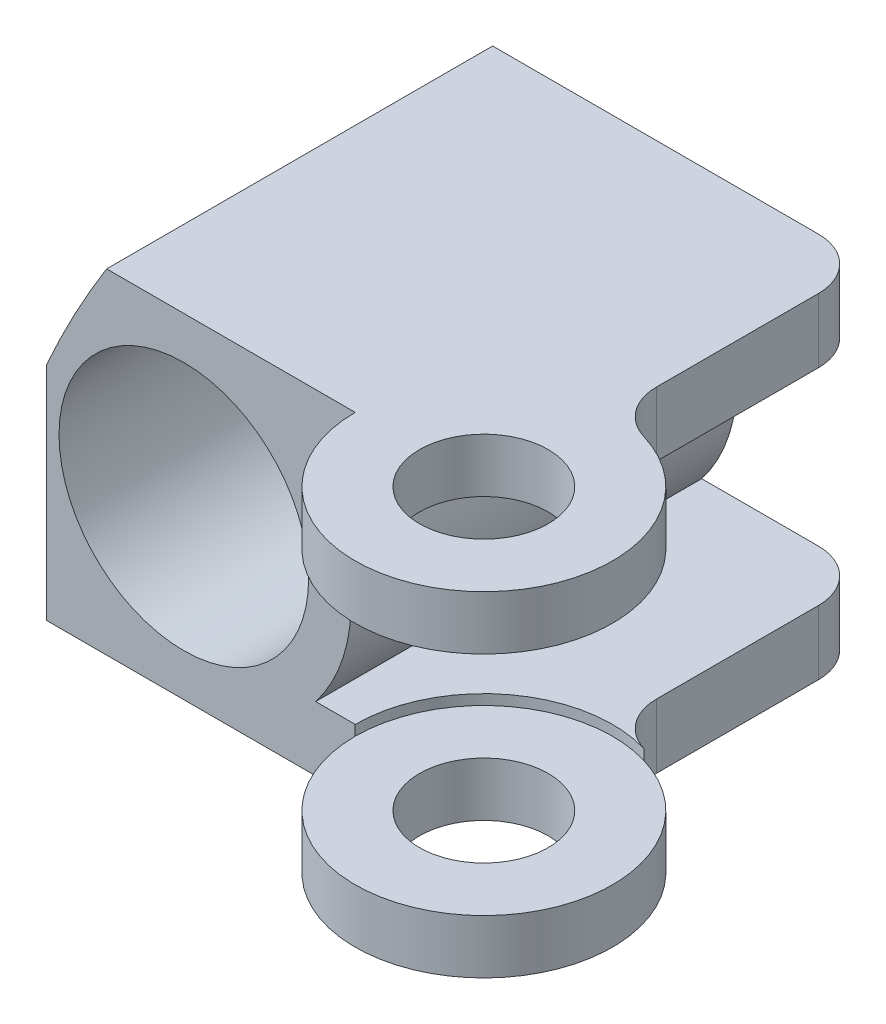
ISO-10303-21;
HEADER;
FILE_DESCRIPTION(('STEP AP214'),'2;1');
FILE_NAME('part.step','',(''),(''),'','','');
FILE_SCHEMA(('AUTOMOTIVE_DESIGN { 1 0 10303 214 1 1 1 1 }'));
ENDSEC;
DATA;
#1=APPLICATION_CONTEXT('core data for automotive mechanical design processes');
#2=APPLICATION_PROTOCOL_DEFINITION('international standard','automotive_design',2000,#1);
#3=PRODUCT_CONTEXT('',#1,'mechanical');
#4=PRODUCT('Part','Part','',(#3));
#5=PRODUCT_RELATED_PRODUCT_CATEGORY('part','',(#4));
#6=PRODUCT_DEFINITION_FORMATION('','',#4);
#7=PRODUCT_DEFINITION_CONTEXT('part definition',#1,'design');
#8=PRODUCT_DEFINITION('design','',#6,#7);
#9=PRODUCT_DEFINITION_SHAPE('','',#8);
#10=(LENGTH_UNIT() NAMED_UNIT(*) SI_UNIT(.MILLI.,.METRE.));
#11=(NAMED_UNIT(*) PLANE_ANGLE_UNIT() SI_UNIT($,.RADIAN.));
#12=(NAMED_UNIT(*) SI_UNIT($,.STERADIAN.) SOLID_ANGLE_UNIT());
#13=UNCERTAINTY_MEASURE_WITH_UNIT(LENGTH_MEASURE(1.E-05),#10,'distance_accuracy_value','');
#14=(GEOMETRIC_REPRESENTATION_CONTEXT(3) GLOBAL_UNCERTAINTY_ASSIGNED_CONTEXT((#13)) GLOBAL_UNIT_ASSIGNED_CONTEXT((#10,
#11,#12)) REPRESENTATION_CONTEXT('',''));
#15=CARTESIAN_POINT('',(0.,0.,0.));
#16=DIRECTION('',(0.,0.,1.));
#17=DIRECTION('',(1.,0.,0.));
#18=AXIS2_PLACEMENT_3D('',#15,#16,#17);
#19=CARTESIAN_POINT('',(-27.3506220886921,10.2658200795581,-25.4));
#20=DIRECTION('',(0.,-1.,0.));
#21=DIRECTION('',(0.,0.,1.));
#22=AXIS2_PLACEMENT_3D('',#19,#20,#21);
#23=PLANE('',#22);
#24=CARTESIAN_POINT('',(-19.05,10.2658200795581,-6.35));
#25=DIRECTION('',(0.,1.,0.));
#26=DIRECTION('',(0.,0.,1.));
#27=AXIS2_PLACEMENT_3D('',#24,#25,#26);
#28=CIRCLE('',#27,6.35);
#29=CARTESIAN_POINT('',(-25.4,10.2658200795581,-6.35));
#30=VERTEX_POINT('',#29);
#31=CARTESIAN_POINT('',(-17.2357142857143,10.2658200795581,-12.4352992816244));
#32=VERTEX_POINT('',#31);
#33=EDGE_CURVE('E192',#30,#32,#28,.F.);
#34=ORIENTED_EDGE('',*,*,#33,.T.);
#35=CARTESIAN_POINT('',(-16.51,10.2658200795581,-14.8694189942742));
#36=DIRECTION('',(0.,1.,0.));
#37=DIRECTION('',(0.,0.,1.));
#38=AXIS2_PLACEMENT_3D('',#35,#36,#37);
#39=CIRCLE('',#38,2.54);
#40=CARTESIAN_POINT('',(-19.05,10.2658200795581,-14.8694189942742));
#41=VERTEX_POINT('',#40);
#42=EDGE_CURVE('E173',#41,#32,#39,.T.);
#43=ORIENTED_EDGE('',*,*,#42,.F.);
#44=DIRECTION('',(0.,0.,1.));
#45=VECTOR('',#44,1.);
#46=CARTESIAN_POINT('',(-19.05,10.2658200795581,-25.4));
#47=LINE('',#46,#45);
#48=CARTESIAN_POINT('',(-19.05,10.2658200795581,-22.86));
#49=VERTEX_POINT('',#48);
#50=EDGE_CURVE('E354',#49,#41,#47,.T.);
#51=ORIENTED_EDGE('',*,*,#50,.F.);
#52=CARTESIAN_POINT('',(-21.59,10.2658200795581,-22.86));
#53=DIRECTION('',(0.,1.,0.));
#54=DIRECTION('',(0.,0.,1.));
#55=AXIS2_PLACEMENT_3D('',#52,#53,#54);
#56=CIRCLE('',#55,2.54);
#57=CARTESIAN_POINT('',(-21.59,10.2658200795581,-25.4));
#58=VERTEX_POINT('',#57);
#59=EDGE_CURVE('E378',#58,#49,#56,.F.);
#60=ORIENTED_EDGE('',*,*,#59,.F.);
#61=DIRECTION('',(-1.,0.,0.));
#62=VECTOR('',#61,1.);
#63=CARTESIAN_POINT('',(-27.3506220886921,10.2658200795581,-25.4));
#64=LINE('',#63,#62);
#65=CARTESIAN_POINT('',(-27.3506220886921,10.2658200795581,-25.4));
#66=VERTEX_POINT('',#65);
#67=EDGE_CURVE('E339',#58,#66,#64,.T.);
#68=ORIENTED_EDGE('',*,*,#67,.T.);
#69=DIRECTION('',(0.,0.,1.));
#70=VECTOR('',#69,1.);
#71=CARTESIAN_POINT('',(-27.3506220886921,10.2658200795581,-25.4));
#72=LINE('',#71,#70);
#73=CARTESIAN_POINT('',(-27.3506220886921,10.2658200795581,-6.35));
#74=VERTEX_POINT('',#73);
#75=EDGE_CURVE('E342',#66,#74,#72,.T.);
#76=ORIENTED_EDGE('',*,*,#75,.T.);
#77=DIRECTION('',(-1.,0.,0.));
#78=VECTOR('',#77,1.);
#79=CARTESIAN_POINT('',(-27.3506220886921,10.2658200795581,-6.35));
#80=LINE('',#79,#78);
#81=EDGE_CURVE('E228',#30,#74,#80,.T.);
#82=ORIENTED_EDGE('',*,*,#81,.F.);
#83=EDGE_LOOP('',(#34,#43,#51,#60,#68,#76,#82));
#84=FACE_BOUND('',#83,.T.);
#85=ADVANCED_FACE('F37',(#84),#23,.F.);
#86=CARTESIAN_POINT('',(-19.05,-1.79917992044194,-6.35));
#87=DIRECTION('',(0.,1.,0.));
#88=DIRECTION('',(0.,0.,-1.));
#89=AXIS2_PLACEMENT_3D('',#86,#87,#88);
#90=CYLINDRICAL_SURFACE('',#89,3.175);
#91=CARTESIAN_POINT('',(-19.05,7.09082007955806,-6.35));
#92=DIRECTION('',(0.,-1.,0.));
#93=DIRECTION('',(0.,0.,-1.));
#94=AXIS2_PLACEMENT_3D('',#91,#92,#93);
#95=CIRCLE('',#94,3.175);
#96=CARTESIAN_POINT('',(-19.05,7.09082007955806,-9.525));
#97=VERTEX_POINT('',#96);
#98=EDGE_CURVE('E317',#97,#97,#95,.T.);
#99=ORIENTED_EDGE('',*,*,#98,.T.);
#100=EDGE_LOOP('',(#99));
#101=FACE_BOUND('',#100,.T.);
#102=CARTESIAN_POINT('',(-19.05,9.75782007955805,-6.35));
#103=DIRECTION('',(0.,-1.,0.));
#104=DIRECTION('',(0.,0.,-1.));
#105=AXIS2_PLACEMENT_3D('',#102,#103,#104);
#106=CIRCLE('',#105,3.175);
#107=CARTESIAN_POINT('',(-19.05,9.75782007955805,-9.525));
#108=VERTEX_POINT('',#107);
#109=EDGE_CURVE('E189',#108,#108,#106,.F.);
#110=ORIENTED_EDGE('',*,*,#109,.T.);
#111=EDGE_LOOP('',(#110));
#112=FACE_BOUND('',#111,.T.);
#113=ADVANCED_FACE('F291',(#101,#112),#90,.F.);
#114=CARTESIAN_POINT('',(-19.05,7.09082007955806,-6.35));
#115=DIRECTION('',(0.,1.,0.));
#116=DIRECTION('',(0.,0.,-1.));
#117=AXIS2_PLACEMENT_3D('',#114,#115,#116);
#118=CYLINDRICAL_SURFACE('',#117,6.35);
#119=CARTESIAN_POINT('',(-19.05,9.75782007955805,-6.35));
#120=DIRECTION('',(0.,-1.,0.));
#121=DIRECTION('',(0.,0.,-1.));
#122=AXIS2_PLACEMENT_3D('',#119,#120,#121);
#123=CIRCLE('',#122,6.35);
#124=CARTESIAN_POINT('',(-17.2357142857143,9.75782007955805,-12.4352992816244));
#125=VERTEX_POINT('',#124);
#126=CARTESIAN_POINT('',(-25.4,9.75782007955805,-6.35));
#127=VERTEX_POINT('',#126);
#128=EDGE_CURVE('E163',#125,#127,#123,.T.);
#129=ORIENTED_EDGE('',*,*,#128,.T.);
#130=DIRECTION('',(0.,1.,0.));
#131=VECTOR('',#130,1.);
#132=CARTESIAN_POINT('',(-25.4,7.09082007955806,-6.35));
#133=LINE('',#132,#131);
#134=CARTESIAN_POINT('',(-25.4,7.09082007955806,-6.35));
#135=VERTEX_POINT('',#134);
#136=EDGE_CURVE('E222',#135,#127,#133,.T.);
#137=ORIENTED_EDGE('',*,*,#136,.F.);
#138=CARTESIAN_POINT('',(-19.05,7.09082007955806,-6.35));
#139=DIRECTION('',(0.,1.,0.));
#140=DIRECTION('',(0.,0.,-1.));
#141=AXIS2_PLACEMENT_3D('',#138,#139,#140);
#142=CIRCLE('',#141,6.35);
#143=CARTESIAN_POINT('',(-17.2357142857143,7.09082007955806,-12.4352992816244));
#144=VERTEX_POINT('',#143);
#145=EDGE_CURVE('E182',#135,#144,#142,.T.);
#146=ORIENTED_EDGE('',*,*,#145,.T.);
#147=DIRECTION('',(0.,1.,0.));
#148=VECTOR('',#147,1.);
#149=CARTESIAN_POINT('',(-17.2357142857143,7.09082007955806,-12.4352992816244));
#150=LINE('',#149,#148);
#151=EDGE_CURVE('E170',#125,#144,#150,.F.);
#152=ORIENTED_EDGE('',*,*,#151,.F.);
#153=EDGE_LOOP('',(#129,#137,#146,#152));
#154=FACE_BOUND('',#153,.T.);
#155=ADVANCED_FACE('F179',(#154),#118,.T.);
#156=CARTESIAN_POINT('',(-33.8574358250765,15.3458200795581,-25.4));
#157=DIRECTION('',(0.,0.,-1.));
#158=DIRECTION('',(1.,0.,0.));
#159=AXIS2_PLACEMENT_3D('',#156,#157,#158);
#160=PLANE('',#159);
#161=DIRECTION('',(1.,0.,0.));
#162=VECTOR('',#161,1.);
#163=CARTESIAN_POINT('',(-43.8807790564313,7.09082007955806,-25.4));
#164=LINE('',#163,#162);
#165=CARTESIAN_POINT('',(-43.8807790564313,7.09082007955806,-25.4));
#166=VERTEX_POINT('',#165);
#167=CARTESIAN_POINT('',(-21.59,7.09082007955806,-25.4));
#168=VERTEX_POINT('',#167);
#169=EDGE_CURVE('E336',#166,#168,#164,.T.);
#170=ORIENTED_EDGE('',*,*,#169,.F.);
#171=CARTESIAN_POINT('',(0.,0.,-25.4));
#172=DIRECTION('',(0.,0.,1.));
#173=DIRECTION('',(-1.,0.,0.));
#174=AXIS2_PLACEMENT_3D('',#171,#172,#173);
#175=CIRCLE('',#174,44.45);
#176=CARTESIAN_POINT('',(-37.6670119809407,23.6008200795581,-25.4));
#177=VERTEX_POINT('',#176);
#178=EDGE_CURVE('E333',#177,#166,#175,.T.);
#179=ORIENTED_EDGE('',*,*,#178,.F.);
#180=DIRECTION('',(-1.,0.,0.));
#181=VECTOR('',#180,1.);
#182=CARTESIAN_POINT('',(-37.6670119809407,23.6008200795581,-25.4));
#183=LINE('',#182,#181);
#184=CARTESIAN_POINT('',(-21.59,23.6008200795581,-25.4));
#185=VERTEX_POINT('',#184);
#186=EDGE_CURVE('E330',#185,#177,#183,.T.);
#187=ORIENTED_EDGE('',*,*,#186,.F.);
#188=DIRECTION('',(0.,1.,0.));
#189=VECTOR('',#188,1.);
#190=CARTESIAN_POINT('',(-21.59,23.6008200795581,-25.4));
#191=LINE('',#190,#189);
#192=CARTESIAN_POINT('',(-21.59,20.4258200795581,-25.4));
#193=VERTEX_POINT('',#192);
#194=EDGE_CURVE('E373',#193,#185,#191,.T.);
#195=ORIENTED_EDGE('',*,*,#194,.F.);
#196=DIRECTION('',(1.,0.,0.));
#197=VECTOR('',#196,1.);
#198=CARTESIAN_POINT('',(-27.3506220886921,20.4258200795581,-25.4));
#199=LINE('',#198,#197);
#200=CARTESIAN_POINT('',(-27.3506220886921,20.4258200795581,-25.4));
#201=VERTEX_POINT('',#200);
#202=EDGE_CURVE('E327',#201,#193,#199,.T.);
#203=ORIENTED_EDGE('',*,*,#202,.F.);
#204=CARTESIAN_POINT('',(-33.8574358250765,15.3458200795581,-25.4));
#205=DIRECTION('',(0.,0.,1.));
#206=DIRECTION('',(1.,0.,0.));
#207=AXIS2_PLACEMENT_3D('',#204,#205,#206);
#208=CIRCLE('',#207,8.255);
#209=EDGE_CURVE('E322',#66,#201,#208,.T.);
#210=ORIENTED_EDGE('',*,*,#209,.F.);
#211=ORIENTED_EDGE('',*,*,#67,.F.);
#212=DIRECTION('',(0.,1.,0.));
#213=VECTOR('',#212,1.);
#214=CARTESIAN_POINT('',(-21.59,10.2658200795581,-25.4));
#215=LINE('',#214,#213);
#216=EDGE_CURVE('E376',#168,#58,#215,.T.);
#217=ORIENTED_EDGE('',*,*,#216,.F.);
#218=EDGE_LOOP('',(#170,#179,#187,#195,#203,#210,#211,#217));
#219=FACE_BOUND('',#218,.T.);
#220=CARTESIAN_POINT('',(-33.8574358250765,15.3458200795581,-25.4));
#221=DIRECTION('',(0.,0.,1.));
#222=DIRECTION('',(1.,0.,0.));
#223=AXIS2_PLACEMENT_3D('',#220,#221,#222);
#224=CIRCLE('',#223,6.1595);
#225=CARTESIAN_POINT('',(-27.6979358250765,15.3458200795581,-25.4));
#226=VERTEX_POINT('',#225);
#227=EDGE_CURVE('E319',#226,#226,#224,.T.);
#228=ORIENTED_EDGE('',*,*,#227,.T.);
#229=EDGE_LOOP('',(#228));
#230=FACE_BOUND('',#229,.T.);
#231=ADVANCED_FACE('F276',(#219,#230),#160,.T.);
#232=CARTESIAN_POINT('',(-33.8574358250765,15.3458200795581,-25.4));
#233=DIRECTION('',(0.,0.,1.));
#234=DIRECTION('',(-1.,0.,0.));
#235=AXIS2_PLACEMENT_3D('',#232,#233,#234);
#236=CYLINDRICAL_SURFACE('',#235,8.255);
#237=ORIENTED_EDGE('',*,*,#75,.F.);
#238=ORIENTED_EDGE('',*,*,#209,.T.);
#239=DIRECTION('',(0.,0.,1.));
#240=VECTOR('',#239,1.);
#241=CARTESIAN_POINT('',(-27.3506220886921,20.4258200795581,-25.4));
#242=LINE('',#241,#240);
#243=CARTESIAN_POINT('',(-27.3506220886921,20.4258200795581,-6.35));
#244=VERTEX_POINT('',#243);
#245=EDGE_CURVE('E351',#201,#244,#242,.T.);
#246=ORIENTED_EDGE('',*,*,#245,.T.);
#247=CARTESIAN_POINT('',(-33.8574358250765,15.3458200795581,-6.35));
#248=DIRECTION('',(0.,0.,1.));
#249=DIRECTION('',(1.,0.,0.));
#250=AXIS2_PLACEMENT_3D('',#247,#248,#249);
#251=CIRCLE('',#250,8.255);
#252=EDGE_CURVE('E231',#74,#244,#251,.T.);
#253=ORIENTED_EDGE('',*,*,#252,.F.);
#254=EDGE_LOOP('',(#237,#238,#246,#253));
#255=FACE_BOUND('',#254,.T.);
#256=ADVANCED_FACE('F272',(#255),#236,.T.);
#257=CARTESIAN_POINT('',(-27.3506220886921,20.4258200795581,-25.4));
#258=DIRECTION('',(0.,1.,0.));
#259=DIRECTION('',(0.,0.,-1.));
#260=AXIS2_PLACEMENT_3D('',#257,#258,#259);
#261=PLANE('',#260);
#262=CARTESIAN_POINT('',(-19.05,20.4258200795581,-6.35));
#263=DIRECTION('',(0.,-1.,0.));
#264=DIRECTION('',(0.,0.,-1.));
#265=AXIS2_PLACEMENT_3D('',#262,#263,#264);
#266=CIRCLE('',#265,6.35);
#267=CARTESIAN_POINT('',(-17.2357142857143,20.4258200795581,-12.4352992816244));
#268=VERTEX_POINT('',#267);
#269=CARTESIAN_POINT('',(-25.4,20.4258200795581,-6.35));
#270=VERTEX_POINT('',#269);
#271=EDGE_CURVE('E196',#268,#270,#266,.F.);
#272=ORIENTED_EDGE('',*,*,#271,.T.);
#273=DIRECTION('',(1.,0.,0.));
#274=VECTOR('',#273,1.);
#275=CARTESIAN_POINT('',(-27.3506220886921,20.4258200795581,-6.35));
#276=LINE('',#275,#274);
#277=EDGE_CURVE('E234',#244,#270,#276,.T.);
#278=ORIENTED_EDGE('',*,*,#277,.F.);
#279=ORIENTED_EDGE('',*,*,#245,.F.);
#280=ORIENTED_EDGE('',*,*,#202,.T.);
#281=CARTESIAN_POINT('',(-21.59,20.4258200795581,-22.86));
#282=DIRECTION('',(0.,-1.,0.));
#283=DIRECTION('',(0.,0.,-1.));
#284=AXIS2_PLACEMENT_3D('',#281,#282,#283);
#285=CIRCLE('',#284,2.54);
#286=CARTESIAN_POINT('',(-19.05,20.4258200795581,-22.86));
#287=VERTEX_POINT('',#286);
#288=EDGE_CURVE('E11',#287,#193,#285,.F.);
#289=ORIENTED_EDGE('',*,*,#288,.F.);
#290=DIRECTION('',(0.,0.,-1.));
#291=VECTOR('',#290,1.);
#292=CARTESIAN_POINT('',(-19.05,20.4258200795581,-25.4));
#293=LINE('',#292,#291);
#294=CARTESIAN_POINT('',(-19.05,20.4258200795581,-14.8694189942742));
#295=VERTEX_POINT('',#294);
#296=EDGE_CURVE('E240',#295,#287,#293,.T.);
#297=ORIENTED_EDGE('',*,*,#296,.F.);
#298=CARTESIAN_POINT('',(-16.51,20.4258200795581,-14.8694189942742));
#299=DIRECTION('',(0.,-1.,0.));
#300=DIRECTION('',(0.,0.,-1.));
#301=AXIS2_PLACEMENT_3D('',#298,#299,#300);
#302=CIRCLE('',#301,2.54);
#303=EDGE_CURVE('E367',#268,#295,#302,.T.);
#304=ORIENTED_EDGE('',*,*,#303,.F.);
#305=EDGE_LOOP('',(#272,#278,#279,#280,#289,#297,#304));
#306=FACE_BOUND('',#305,.T.);
#307=ADVANCED_FACE('F268',(#306),#261,.F.);
#308=CARTESIAN_POINT('',(-37.6670119809407,23.6008200795581,-25.4));
#309=DIRECTION('',(0.,-1.,0.));
#310=DIRECTION('',(0.,0.,1.));
#311=AXIS2_PLACEMENT_3D('',#308,#309,#310);
#312=PLANE('',#311);
#313=ORIENTED_EDGE('',*,*,#186,.T.);
#314=DIRECTION('',(0.,0.,1.));
#315=VECTOR('',#314,1.);
#316=CARTESIAN_POINT('',(-37.6670119809407,23.6008200795581,-25.4));
#317=LINE('',#316,#315);
#318=CARTESIAN_POINT('',(-37.6670119809407,23.6008200795581,-6.35));
#319=VERTEX_POINT('',#318);
#320=EDGE_CURVE('E348',#177,#319,#317,.T.);
#321=ORIENTED_EDGE('',*,*,#320,.T.);
#322=DIRECTION('',(1.,0.,0.));
#323=VECTOR('',#322,1.);
#324=CARTESIAN_POINT('',(-40.64,23.6008200795581,-6.35));
#325=LINE('',#324,#323);
#326=CARTESIAN_POINT('',(-25.4,23.6008200795581,-6.35));
#327=VERTEX_POINT('',#326);
#328=EDGE_CURVE('E203',#319,#327,#325,.T.);
#329=ORIENTED_EDGE('',*,*,#328,.T.);
#330=CARTESIAN_POINT('',(-19.05,23.6008200795581,-6.35));
#331=DIRECTION('',(0.,1.,0.));
#332=DIRECTION('',(0.,0.,-1.));
#333=AXIS2_PLACEMENT_3D('',#330,#331,#332);
#334=CIRCLE('',#333,6.35);
#335=CARTESIAN_POINT('',(-17.2357142857143,23.6008200795581,-12.4352992816244));
#336=VERTEX_POINT('',#335);
#337=EDGE_CURVE('E217',#327,#336,#334,.T.);
#338=ORIENTED_EDGE('',*,*,#337,.T.);
#339=CARTESIAN_POINT('',(-16.51,23.6008200795581,-14.8694189942742));
#340=DIRECTION('',(0.,1.,0.));
#341=DIRECTION('',(0.,0.,1.));
#342=AXIS2_PLACEMENT_3D('',#339,#340,#341);
#343=CIRCLE('',#342,2.54);
#344=CARTESIAN_POINT('',(-19.05,23.6008200795581,-14.8694189942742));
#345=VERTEX_POINT('',#344);
#346=EDGE_CURVE('E175',#345,#336,#343,.T.);
#347=ORIENTED_EDGE('',*,*,#346,.F.);
#348=DIRECTION('',(0.,0.,-1.));
#349=VECTOR('',#348,1.);
#350=CARTESIAN_POINT('',(-19.05,23.6008200795581,-12.7));
#351=LINE('',#350,#349);
#352=CARTESIAN_POINT('',(-19.05,23.6008200795581,-22.86));
#353=VERTEX_POINT('',#352);
#354=EDGE_CURVE('E208',#345,#353,#351,.T.);
#355=ORIENTED_EDGE('',*,*,#354,.T.);
#356=CARTESIAN_POINT('',(-21.59,23.6008200795581,-22.86));
#357=DIRECTION('',(0.,1.,0.));
#358=DIRECTION('',(0.,0.,1.));
#359=AXIS2_PLACEMENT_3D('',#356,#357,#358);
#360=CIRCLE('',#359,2.54);
#361=EDGE_CURVE('E385',#185,#353,#360,.F.);
#362=ORIENTED_EDGE('',*,*,#361,.F.);
#363=EDGE_LOOP('',(#313,#321,#329,#338,#347,#355,#362));
#364=FACE_BOUND('',#363,.T.);
#365=CARTESIAN_POINT('',(-19.05,23.6008200795581,-6.35));
#366=DIRECTION('',(0.,-1.,0.));
#367=DIRECTION('',(0.,0.,-1.));
#368=AXIS2_PLACEMENT_3D('',#365,#366,#367);
#369=CIRCLE('',#368,3.175);
#370=CARTESIAN_POINT('',(-19.05,23.6008200795581,-9.525));
#371=VERTEX_POINT('',#370);
#372=EDGE_CURVE('E251',#371,#371,#369,.T.);
#373=ORIENTED_EDGE('',*,*,#372,.T.);
#374=EDGE_LOOP('',(#373));
#375=FACE_BOUND('',#374,.T.);
#376=ADVANCED_FACE('F263',(#364,#375),#312,.F.);
#377=CARTESIAN_POINT('',(0.,0.,-25.4));
#378=DIRECTION('',(0.,0.,1.));
#379=DIRECTION('',(-1.,0.,0.));
#380=AXIS2_PLACEMENT_3D('',#377,#378,#379);
#381=CYLINDRICAL_SURFACE('',#380,44.45);
#382=CARTESIAN_POINT('',(0.,0.,-6.35));
#383=DIRECTION('',(0.,0.,1.));
#384=DIRECTION('',(1.,0.,0.));
#385=AXIS2_PLACEMENT_3D('',#382,#383,#384);
#386=CIRCLE('',#385,44.45);
#387=CARTESIAN_POINT('',(-40.64,18.0053575360224,-6.35));
#388=VERTEX_POINT('',#387);
#389=EDGE_CURVE('E237',#319,#388,#386,.T.);
#390=ORIENTED_EDGE('',*,*,#389,.F.);
#391=ORIENTED_EDGE('',*,*,#320,.F.);
#392=ORIENTED_EDGE('',*,*,#178,.T.);
#393=DIRECTION('',(0.,0.,1.));
#394=VECTOR('',#393,1.);
#395=CARTESIAN_POINT('',(-43.8807790564313,7.09082007955806,-25.4));
#396=LINE('',#395,#394);
#397=CARTESIAN_POINT('',(-43.8807790564313,7.09082007955806,-11.8867179017965));
#398=VERTEX_POINT('',#397);
#399=EDGE_CURVE('E345',#166,#398,#396,.T.);
#400=ORIENTED_EDGE('',*,*,#399,.T.);
#401=CARTESIAN_POINT('',(-40.64,18.0053575360224,-6.35));
#402=CARTESIAN_POINT('',(-40.6399858684762,18.0053850674031,-6.42860205927988));
#403=CARTESIAN_POINT('',(-40.6414589667043,18.0020644090249,-6.50718713842052));
#404=CARTESIAN_POINT('',(-40.6472714524176,17.9889387291809,-6.6636382192536));
#405=CARTESIAN_POINT('',(-40.6516082538039,17.979139558198,-6.74150480551763));
#406=CARTESIAN_POINT('',(-40.6629877454723,17.953387179122,-6.89526719531025));
#407=CARTESIAN_POINT('',(-40.670005174567,17.9374914174421,-6.97117453940111));
#408=CARTESIAN_POINT('',(-40.6865585221489,17.8999128340143,-7.12125351985808));
#409=CARTESIAN_POINT('',(-40.6960948907276,17.8782289780255,-7.19542484344604));
#410=CARTESIAN_POINT('',(-40.7280809302924,17.8053006165963,-7.41418329624837));
#411=CARTESIAN_POINT('',(-40.7539593059729,17.7460632897751,-7.55567326486585));
#412=CARTESIAN_POINT('',(-40.8129268155589,17.6100265474026,-7.82846613663836));
#413=CARTESIAN_POINT('',(-40.8460337895425,17.5331836580071,-7.95974272639628));
#414=CARTESIAN_POINT('',(-40.9432545484435,17.3053912774347,-8.30191851672014));
#415=CARTESIAN_POINT('',(-41.0125677515992,17.1408389041428,-8.50233665325664));
#416=CARTESIAN_POINT('',(-41.1227473901252,16.8739931244987,-8.78060266897358));
#417=CARTESIAN_POINT('',(-41.160581652018,16.7815262143035,-8.86976949615618));
#418=CARTESIAN_POINT('',(-41.2377412537271,16.5910131308004,-9.0412530228011));
#419=CARTESIAN_POINT('',(-41.2770662713191,16.492968160912,-9.1235711904387));
#420=CARTESIAN_POINT('',(-41.3892881018672,16.2101141877237,-9.34676355510312));
#421=CARTESIAN_POINT('',(-41.4632986423793,16.0200194827513,-9.48036971614077));
#422=CARTESIAN_POINT('',(-41.612304225724,15.6289016411106,-9.72993927328907));
#423=CARTESIAN_POINT('',(-41.687300072299,15.4278691004059,-9.84588715128312));
#424=CARTESIAN_POINT('',(-41.8369591075026,15.0172968330521,-10.0629604635134));
#425=CARTESIAN_POINT('',(-41.9116212420885,14.8077398368429,-10.1640536771114));
#426=CARTESIAN_POINT('',(-42.0594463948925,14.3824948297918,-10.3533162747553));
#427=CARTESIAN_POINT('',(-42.1326098434426,14.1668086225886,-10.4414894147122));
#428=CARTESIAN_POINT('',(-42.2840664126217,13.7085444117589,-10.6151224590177));
#429=CARTESIAN_POINT('',(-42.3621317889708,13.4654496892092,-10.6994099343058));
#430=CARTESIAN_POINT('',(-42.5150453128146,12.9745731407807,-10.8565832502906));
#431=CARTESIAN_POINT('',(-42.5898926791861,12.7267901976925,-10.9294663339493));
#432=CARTESIAN_POINT('',(-42.7359817981814,12.2272704887145,-11.0654845232775));
#433=CARTESIAN_POINT('',(-42.8072201931958,11.9755303164475,-11.1286106595937));
#434=CARTESIAN_POINT('',(-42.9457122756752,11.4689695287864,-11.2463756369765));
#435=CARTESIAN_POINT('',(-43.012965494977,11.2141485556887,-11.3010134820888));
#436=CARTESIAN_POINT('',(-43.1432601708625,10.7019363824853,-11.4029135052793));
#437=CARTESIAN_POINT('',(-43.2063010465743,10.4445448335055,-11.4501746673263));
#438=CARTESIAN_POINT('',(-43.3279970552494,9.92762373124177,-11.5382422780082));
#439=CARTESIAN_POINT('',(-43.3866518278721,9.66809400423591,-11.5790481966186));
#440=CARTESIAN_POINT('',(-43.5557643325157,8.88714520807768,-11.6929499554332));
#441=CARTESIAN_POINT('',(-43.6594672686087,8.3629857111762,-11.7576028532993));
#442=CARTESIAN_POINT('',(-43.7760131513114,7.71226899882168,-11.8266259838594));
#443=CARTESIAN_POINT('',(-43.7977140320062,7.5880611330193,-11.8392985217988));
#444=CARTESIAN_POINT('',(-43.8400424608099,7.33955210516721,-11.8636986749844));
#445=CARTESIAN_POINT('',(-43.8606714812607,7.21525132251778,-11.8754275992517));
#446=CARTESIAN_POINT('',(-43.8807790564313,7.09082007955806,-11.8867179017965));
#447=B_SPLINE_CURVE_WITH_KNOTS('',3,(#401,#402,#403,#404,#405,#406,#407,#408,#409,#410,#411,
#412,#413,#414,#415,#416,#417,#418,#419,#420,#421,#422,#423,#424,#425,#426,#427,#428,#429,#430,
#431,#432,#433,#434,#435,#436,#437,#438,#439,#440,#441,#442,#443,#444,#445,#446),.UNSPECIFIED.,
.F.,.F.,(4,2,2,2,2,2,2,2,2,2,2,2,2,2,2,2,2,2,2,2,2,2,4),(0.,0.235694740019568,0.471176923855376,
0.704492676434341,0.937850146784164,1.4025774760099,1.86846497782513,2.66874785915352,
3.07031815307747,3.47180213771034,4.20215206583604,4.93314016787749,5.66569113444536,
6.39802872157083,7.20429450491854,8.01075490473667,8.81795231266198,9.62524435983153,
10.4326475018449,11.2401169034104,12.8538582290616,13.2340305774573,13.6136660991286),.UNSPECIFIED.);
#448=EDGE_CURVE('E242',#388,#398,#447,.T.);
#449=ORIENTED_EDGE('',*,*,#448,.F.);
#450=EDGE_LOOP('',(#390,#391,#392,#400,#449));
#451=FACE_BOUND('',#450,.T.);
#452=ADVANCED_FACE('F257',(#451),#381,.T.);
#453=CARTESIAN_POINT('',(-43.8807790564313,7.09082007955806,-25.4));
#454=DIRECTION('',(0.,1.,0.));
#455=DIRECTION('',(0.,0.,-1.));
#456=AXIS2_PLACEMENT_3D('',#453,#454,#455);
#457=PLANE('',#456);
#458=DIRECTION('',(0.,0.,-1.));
#459=VECTOR('',#458,1.);
#460=CARTESIAN_POINT('',(-19.05,7.09082007955806,-12.7));
#461=LINE('',#460,#459);
#462=CARTESIAN_POINT('',(-19.05,7.09082007955806,-14.8694189942742));
#463=VERTEX_POINT('',#462);
#464=CARTESIAN_POINT('',(-19.05,7.09082007955806,-22.86));
#465=VERTEX_POINT('',#464);
#466=EDGE_CURVE('E211',#463,#465,#461,.T.);
#467=ORIENTED_EDGE('',*,*,#466,.F.);
#468=CARTESIAN_POINT('',(-16.51,7.09082007955806,-14.8694189942742));
#469=DIRECTION('',(0.,-1.,0.));
#470=DIRECTION('',(0.,0.,-1.));
#471=AXIS2_PLACEMENT_3D('',#468,#469,#470);
#472=CIRCLE('',#471,2.54);
#473=EDGE_CURVE('E371',#144,#463,#472,.T.);
#474=ORIENTED_EDGE('',*,*,#473,.F.);
#475=ORIENTED_EDGE('',*,*,#145,.F.);
#476=DIRECTION('',(1.,0.,0.));
#477=VECTOR('',#476,1.);
#478=CARTESIAN_POINT('',(-40.64,7.09082007955806,-6.35));
#479=LINE('',#478,#477);
#480=CARTESIAN_POINT('',(-40.64,7.09082007955806,-6.35));
#481=VERTEX_POINT('',#480);
#482=EDGE_CURVE('E207',#481,#135,#479,.T.);
#483=ORIENTED_EDGE('',*,*,#482,.F.);
#484=CARTESIAN_POINT('',(-46.99,7.09082007955806,-6.35));
#485=DIRECTION('',(0.,-1.,0.));
#486=DIRECTION('',(0.,0.,-1.));
#487=AXIS2_PLACEMENT_3D('',#484,#485,#486);
#488=CIRCLE('',#487,6.35);
#489=EDGE_CURVE('E204',#398,#481,#488,.T.);
#490=ORIENTED_EDGE('',*,*,#489,.F.);
#491=ORIENTED_EDGE('',*,*,#399,.F.);
#492=ORIENTED_EDGE('',*,*,#169,.T.);
#493=CARTESIAN_POINT('',(-21.59,7.09082007955806,-22.86));
#494=DIRECTION('',(0.,-1.,0.));
#495=DIRECTION('',(0.,0.,-1.));
#496=AXIS2_PLACEMENT_3D('',#493,#494,#495);
#497=CIRCLE('',#496,2.54);
#498=EDGE_CURVE('E383',#465,#168,#497,.F.);
#499=ORIENTED_EDGE('',*,*,#498,.F.);
#500=EDGE_LOOP('',(#467,#474,#475,#483,#490,#491,#492,#499));
#501=FACE_BOUND('',#500,.T.);
#502=ORIENTED_EDGE('',*,*,#98,.F.);
#503=EDGE_LOOP('',(#502));
#504=FACE_BOUND('',#503,.T.);
#505=ADVANCED_FACE('F262',(#501,#504),#457,.F.);
#506=CARTESIAN_POINT('',(-33.8574358250765,15.3458200795581,-25.4));
#507=DIRECTION('',(0.,0.,1.));
#508=DIRECTION('',(-1.,0.,0.));
#509=AXIS2_PLACEMENT_3D('',#506,#507,#508);
#510=CYLINDRICAL_SURFACE('',#509,6.1595);
#511=CARTESIAN_POINT('',(-33.8574358250765,15.3458200795581,-6.35));
#512=DIRECTION('',(0.,0.,1.));
#513=DIRECTION('',(1.,0.,0.));
#514=AXIS2_PLACEMENT_3D('',#511,#512,#513);
#515=CIRCLE('',#514,6.1595);
#516=CARTESIAN_POINT('',(-27.6979358250765,15.3458200795581,-6.35));
#517=VERTEX_POINT('',#516);
#518=EDGE_CURVE('E224',#517,#517,#515,.T.);
#519=ORIENTED_EDGE('',*,*,#518,.T.);
#520=EDGE_LOOP('',(#519));
#521=FACE_BOUND('',#520,.T.);
#522=ORIENTED_EDGE('',*,*,#227,.F.);
#523=EDGE_LOOP('',(#522));
#524=FACE_BOUND('',#523,.T.);
#525=ADVANCED_FACE('F302',(#521,#524),#510,.F.);
#526=CARTESIAN_POINT('',(-19.05,20.9338200795581,-6.35));
#527=DIRECTION('',(0.,-1.,0.));
#528=DIRECTION('',(0.,0.,-1.));
#529=AXIS2_PLACEMENT_3D('',#526,#527,#528);
#530=CIRCLE('',#529,3.175);
#531=CARTESIAN_POINT('',(-19.05,20.9338200795581,-9.525));
#532=VERTEX_POINT('',#531);
#533=EDGE_CURVE('E200',#532,#532,#530,.F.);
#534=ORIENTED_EDGE('',*,*,#533,.F.);
#535=EDGE_LOOP('',(#534));
#536=FACE_BOUND('',#535,.T.);
#537=ORIENTED_EDGE('',*,*,#372,.F.);
#538=EDGE_LOOP('',(#537));
#539=FACE_BOUND('',#538,.T.);
#540=ADVANCED_FACE('F297',(#536,#539),#90,.F.);
#541=CARTESIAN_POINT('',(-40.64,7.09082007955806,-6.35));
#542=DIRECTION('',(0.,0.,-1.));
#543=DIRECTION('',(1.,0.,0.));
#544=AXIS2_PLACEMENT_3D('',#541,#542,#543);
#545=PLANE('',#544);
#546=ORIENTED_EDGE('',*,*,#518,.F.);
#547=EDGE_LOOP('',(#546));
#548=FACE_BOUND('',#547,.T.);
#549=ORIENTED_EDGE('',*,*,#328,.F.);
#550=ORIENTED_EDGE('',*,*,#389,.T.);
#551=DIRECTION('',(0.,1.,0.));
#552=VECTOR('',#551,1.);
#553=CARTESIAN_POINT('',(-40.64,7.09082007955806,-6.35));
#554=LINE('',#553,#552);
#555=EDGE_CURVE('E214',#481,#388,#554,.T.);
#556=ORIENTED_EDGE('',*,*,#555,.F.);
#557=ORIENTED_EDGE('',*,*,#482,.T.);
#558=ORIENTED_EDGE('',*,*,#136,.T.);
#559=DIRECTION('',(0.,-1.,0.));
#560=VECTOR('',#559,1.);
#561=CARTESIAN_POINT('',(-25.4,20.9338200795581,-6.35));
#562=LINE('',#561,#560);
#563=EDGE_CURVE('E159',#127,#30,#562,.F.);
#564=ORIENTED_EDGE('',*,*,#563,.T.);
#565=ORIENTED_EDGE('',*,*,#81,.T.);
#566=ORIENTED_EDGE('',*,*,#252,.T.);
#567=ORIENTED_EDGE('',*,*,#277,.T.);
#568=CARTESIAN_POINT('',(-25.4,20.9338200795581,-6.35));
#569=VERTEX_POINT('',#568);
#570=EDGE_CURVE('E225',#270,#569,#133,.T.);
#571=ORIENTED_EDGE('',*,*,#570,.T.);
#572=EDGE_CURVE('E226',#569,#327,#133,.T.);
#573=ORIENTED_EDGE('',*,*,#572,.T.);
#574=EDGE_LOOP('',(#549,#550,#556,#557,#558,#564,#565,#566,#567,#571,#573));
#575=FACE_BOUND('',#574,.T.);
#576=ADVANCED_FACE('F306',(#548,#575),#545,.F.);
#577=CARTESIAN_POINT('',(-46.99,7.09082007955806,-6.35));
#578=DIRECTION('',(0.,1.,0.));
#579=DIRECTION('',(0.,0.,-1.));
#580=AXIS2_PLACEMENT_3D('',#577,#578,#579);
#581=CYLINDRICAL_SURFACE('',#580,6.35);
#582=ORIENTED_EDGE('',*,*,#555,.T.);
#583=ORIENTED_EDGE('',*,*,#448,.T.);
#584=ORIENTED_EDGE('',*,*,#489,.T.);
#585=EDGE_LOOP('',(#582,#583,#584));
#586=FACE_BOUND('',#585,.T.);
#587=ADVANCED_FACE('F253',(#586),#581,.F.);
#588=DIRECTION('',(0.,1.,0.));
#589=VECTOR('',#588,1.);
#590=CARTESIAN_POINT('',(-17.2357142857143,7.09082007955806,-12.4352992816244));
#591=LINE('',#590,#589);
#592=CARTESIAN_POINT('',(-17.2357142857143,20.9338200795581,-12.4352992816244));
#593=VERTEX_POINT('',#592);
#594=EDGE_CURVE('E361',#336,#593,#591,.F.);
#595=ORIENTED_EDGE('',*,*,#594,.F.);
#596=ORIENTED_EDGE('',*,*,#337,.F.);
#597=ORIENTED_EDGE('',*,*,#572,.F.);
#598=CARTESIAN_POINT('',(-19.05,20.9338200795581,-6.35));
#599=DIRECTION('',(0.,-1.,0.));
#600=DIRECTION('',(0.,0.,-1.));
#601=AXIS2_PLACEMENT_3D('',#598,#599,#600);
#602=CIRCLE('',#601,6.35);
#603=EDGE_CURVE('E186',#593,#569,#602,.T.);
#604=ORIENTED_EDGE('',*,*,#603,.F.);
#605=EDGE_LOOP('',(#595,#596,#597,#604));
#606=FACE_BOUND('',#605,.T.);
#607=ADVANCED_FACE('F406',(#606),#118,.T.);
#608=CARTESIAN_POINT('',(-19.05,7.09082007955806,-12.7));
#609=DIRECTION('',(-1.,0.,0.));
#610=DIRECTION('',(0.,0.,-1.));
#611=AXIS2_PLACEMENT_3D('',#608,#609,#610);
#612=PLANE('',#611);
#613=ORIENTED_EDGE('',*,*,#50,.T.);
#614=DIRECTION('',(0.,-1.,0.));
#615=VECTOR('',#614,1.);
#616=CARTESIAN_POINT('',(-19.05,10.2658200795581,-14.8694189942742));
#617=LINE('',#616,#615);
#618=EDGE_CURVE('E183',#463,#41,#617,.F.);
#619=ORIENTED_EDGE('',*,*,#618,.F.);
#620=ORIENTED_EDGE('',*,*,#466,.T.);
#621=DIRECTION('',(0.,1.,0.));
#622=VECTOR('',#621,1.);
#623=CARTESIAN_POINT('',(-19.05,7.09082007955806,-22.86));
#624=LINE('',#623,#622);
#625=EDGE_CURVE('E381',#49,#465,#624,.F.);
#626=ORIENTED_EDGE('',*,*,#625,.F.);
#627=EDGE_LOOP('',(#613,#619,#620,#626));
#628=FACE_BOUND('',#627,.T.);
#629=ADVANCED_FACE('F421',(#628),#612,.F.);
#630=ORIENTED_EDGE('',*,*,#354,.F.);
#631=DIRECTION('',(0.,-1.,0.));
#632=VECTOR('',#631,1.);
#633=CARTESIAN_POINT('',(-19.05,23.6008200795581,-14.8694189942742));
#634=LINE('',#633,#632);
#635=EDGE_CURVE('E359',#295,#345,#634,.F.);
#636=ORIENTED_EDGE('',*,*,#635,.F.);
#637=ORIENTED_EDGE('',*,*,#296,.T.);
#638=DIRECTION('',(0.,1.,0.));
#639=VECTOR('',#638,1.);
#640=CARTESIAN_POINT('',(-19.05,20.4258200795581,-22.86));
#641=LINE('',#640,#639);
#642=EDGE_CURVE('E45',#353,#287,#641,.F.);
#643=ORIENTED_EDGE('',*,*,#642,.F.);
#644=EDGE_LOOP('',(#630,#636,#637,#643));
#645=FACE_BOUND('',#644,.T.);
#646=ADVANCED_FACE('F281',(#645),#612,.F.);
#647=CARTESIAN_POINT('',(-16.51,7.09082007955806,-14.8694189942742));
#648=DIRECTION('',(0.,1.,0.));
#649=DIRECTION('',(0.,0.,-1.));
#650=AXIS2_PLACEMENT_3D('',#647,#648,#649);
#651=CYLINDRICAL_SURFACE('',#650,2.54);
#652=ORIENTED_EDGE('',*,*,#303,.T.);
#653=ORIENTED_EDGE('',*,*,#635,.T.);
#654=ORIENTED_EDGE('',*,*,#346,.T.);
#655=ORIENTED_EDGE('',*,*,#594,.T.);
#656=DIRECTION('',(0.,-1.,0.));
#657=VECTOR('',#656,1.);
#658=CARTESIAN_POINT('',(-17.2357142857143,15.3458200795581,-12.4352992816244));
#659=LINE('',#658,#657);
#660=EDGE_CURVE('E194',#593,#268,#659,.T.);
#661=ORIENTED_EDGE('',*,*,#660,.T.);
#662=EDGE_LOOP('',(#652,#653,#654,#655,#661));
#663=FACE_BOUND('',#662,.T.);
#664=ADVANCED_FACE('F278',(#663),#651,.F.);
#665=CARTESIAN_POINT('',(-16.51,7.09082007955806,-14.8694189942742));
#666=DIRECTION('',(0.,1.,0.));
#667=DIRECTION('',(0.,0.,-1.));
#668=AXIS2_PLACEMENT_3D('',#665,#666,#667);
#669=CYLINDRICAL_SURFACE('',#668,2.54);
#670=ORIENTED_EDGE('',*,*,#473,.T.);
#671=ORIENTED_EDGE('',*,*,#618,.T.);
#672=ORIENTED_EDGE('',*,*,#42,.T.);
#673=EDGE_CURVE('E157',#32,#125,#150,.F.);
#674=ORIENTED_EDGE('',*,*,#673,.T.);
#675=ORIENTED_EDGE('',*,*,#151,.T.);
#676=EDGE_LOOP('',(#670,#671,#672,#674,#675));
#677=FACE_BOUND('',#676,.T.);
#678=ADVANCED_FACE('F169',(#677),#669,.F.);
#679=CARTESIAN_POINT('',(-21.59,15.3458200795581,-22.86));
#680=DIRECTION('',(0.,-1.,0.));
#681=DIRECTION('',(0.,0.,1.));
#682=AXIS2_PLACEMENT_3D('',#679,#680,#681);
#683=CYLINDRICAL_SURFACE('',#682,2.54);
#684=ORIENTED_EDGE('',*,*,#498,.T.);
#685=ORIENTED_EDGE('',*,*,#216,.T.);
#686=ORIENTED_EDGE('',*,*,#59,.T.);
#687=ORIENTED_EDGE('',*,*,#625,.T.);
#688=EDGE_LOOP('',(#684,#685,#686,#687));
#689=FACE_BOUND('',#688,.T.);
#690=ADVANCED_FACE('F284',(#689),#683,.T.);
#691=CARTESIAN_POINT('',(-21.59,15.3458200795581,-22.86));
#692=DIRECTION('',(0.,-1.,0.));
#693=DIRECTION('',(0.,0.,1.));
#694=AXIS2_PLACEMENT_3D('',#691,#692,#693);
#695=CYLINDRICAL_SURFACE('',#694,2.54);
#696=ORIENTED_EDGE('',*,*,#288,.T.);
#697=ORIENTED_EDGE('',*,*,#194,.T.);
#698=ORIENTED_EDGE('',*,*,#361,.T.);
#699=ORIENTED_EDGE('',*,*,#642,.T.);
#700=EDGE_LOOP('',(#696,#697,#698,#699));
#701=FACE_BOUND('',#700,.T.);
#702=ADVANCED_FACE('F39',(#701),#695,.T.);
#703=CARTESIAN_POINT('',(-19.05,20.9338200795581,-6.35));
#704=DIRECTION('',(0.,-1.,0.));
#705=DIRECTION('',(0.,0.,1.));
#706=AXIS2_PLACEMENT_3D('',#703,#704,#705);
#707=CYLINDRICAL_SURFACE('',#706,6.35);
#708=ORIENTED_EDGE('',*,*,#563,.F.);
#709=EDGE_CURVE('E153',#127,#125,#123,.T.);
#710=ORIENTED_EDGE('',*,*,#709,.T.);
#711=ORIENTED_EDGE('',*,*,#673,.F.);
#712=ORIENTED_EDGE('',*,*,#33,.F.);
#713=EDGE_LOOP('',(#708,#710,#711,#712));
#714=FACE_BOUND('',#713,.T.);
#715=ADVANCED_FACE('F155',(#714),#707,.F.);
#716=CARTESIAN_POINT('',(-19.05,9.75782007955805,-6.35));
#717=DIRECTION('',(0.,1.,0.));
#718=DIRECTION('',(0.,0.,-1.));
#719=AXIS2_PLACEMENT_3D('',#716,#717,#718);
#720=PLANE('',#719);
#721=ORIENTED_EDGE('',*,*,#128,.F.);
#722=ORIENTED_EDGE('',*,*,#709,.F.);
#723=EDGE_LOOP('',(#721,#722));
#724=FACE_BOUND('',#723,.T.);
#725=ORIENTED_EDGE('',*,*,#109,.F.);
#726=EDGE_LOOP('',(#725));
#727=FACE_BOUND('',#726,.T.);
#728=ADVANCED_FACE('F184',(#724,#727),#720,.T.);
#729=CARTESIAN_POINT('',(-19.05,20.9338200795581,-6.35));
#730=DIRECTION('',(0.,1.,0.));
#731=DIRECTION('',(0.,0.,-1.));
#732=AXIS2_PLACEMENT_3D('',#729,#730,#731);
#733=PLANE('',#732);
#734=ORIENTED_EDGE('',*,*,#603,.T.);
#735=EDGE_CURVE('E51',#569,#593,#602,.T.);
#736=ORIENTED_EDGE('',*,*,#735,.T.);
#737=EDGE_LOOP('',(#734,#736));
#738=FACE_BOUND('',#737,.T.);
#739=ORIENTED_EDGE('',*,*,#533,.T.);
#740=EDGE_LOOP('',(#739));
#741=FACE_BOUND('',#740,.T.);
#742=ADVANCED_FACE('F552',(#738,#741),#733,.F.);
#743=ORIENTED_EDGE('',*,*,#570,.F.);
#744=ORIENTED_EDGE('',*,*,#271,.F.);
#745=ORIENTED_EDGE('',*,*,#660,.F.);
#746=ORIENTED_EDGE('',*,*,#735,.F.);
#747=EDGE_LOOP('',(#743,#744,#745,#746));
#748=FACE_BOUND('',#747,.T.);
#749=ADVANCED_FACE('F409',(#748),#707,.F.);
#750=CLOSED_SHELL('',(#85,#113,#155,#231,#256,#307,#376,#452,#505,#525,#540,#576,#587,#607,#629,
#646,#664,#678,#690,#702,#715,#728,#742,#749));
#751=MANIFOLD_SOLID_BREP('B2',#750);
#752=ADVANCED_BREP_SHAPE_REPRESENTATION('',(#18,#751),#14);
#753=SHAPE_DEFINITION_REPRESENTATION(#9,#752);
ENDSEC;
END-ISO-10303-21;
